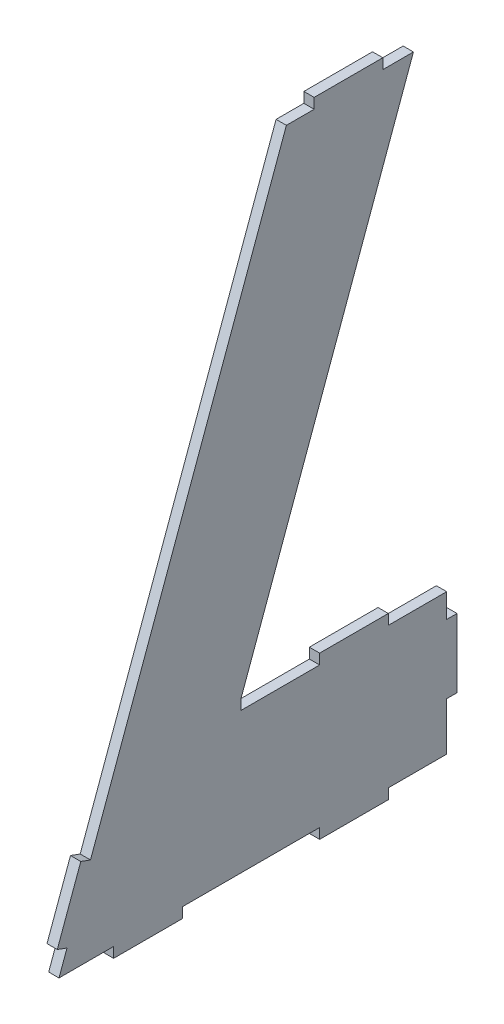
ISO-10303-21;
HEADER;
FILE_DESCRIPTION(('STEP AP214'),'2;1');
FILE_NAME('part.step','',(''),(''),'','','');
FILE_SCHEMA(('AUTOMOTIVE_DESIGN { 1 0 10303 214 1 1 1 1 }'));
ENDSEC;
DATA;
#1=APPLICATION_CONTEXT('core data for automotive mechanical design processes');
#2=APPLICATION_PROTOCOL_DEFINITION('international standard','automotive_design',2000,#1);
#3=PRODUCT_CONTEXT('',#1,'mechanical');
#4=PRODUCT('Part','Part','',(#3));
#5=PRODUCT_RELATED_PRODUCT_CATEGORY('part','',(#4));
#6=PRODUCT_DEFINITION_FORMATION('','',#4);
#7=PRODUCT_DEFINITION_CONTEXT('part definition',#1,'design');
#8=PRODUCT_DEFINITION('design','',#6,#7);
#9=PRODUCT_DEFINITION_SHAPE('','',#8);
#10=(LENGTH_UNIT() NAMED_UNIT(*) SI_UNIT(.MILLI.,.METRE.));
#11=(NAMED_UNIT(*) PLANE_ANGLE_UNIT() SI_UNIT($,.RADIAN.));
#12=(NAMED_UNIT(*) SI_UNIT($,.STERADIAN.) SOLID_ANGLE_UNIT());
#13=UNCERTAINTY_MEASURE_WITH_UNIT(LENGTH_MEASURE(1.E-05),#10,'distance_accuracy_value','');
#14=(GEOMETRIC_REPRESENTATION_CONTEXT(3) GLOBAL_UNCERTAINTY_ASSIGNED_CONTEXT((#13)) GLOBAL_UNIT_ASSIGNED_CONTEXT((#10,
#11,#12)) REPRESENTATION_CONTEXT('',''));
#15=CARTESIAN_POINT('',(0.,0.,0.));
#16=DIRECTION('',(0.,0.,1.));
#17=DIRECTION('',(1.,0.,0.));
#18=AXIS2_PLACEMENT_3D('',#15,#16,#17);
#19=CARTESIAN_POINT('',(3.001,184.938524157182,-70.3121179623345));
#20=DIRECTION('',(0.,-0.342020143325666,-0.939692620785909));
#21=DIRECTION('',(0.,0.93969262078591,-0.342020143325666));
#22=AXIS2_PLACEMENT_3D('',#19,#20,#21);
#23=PLANE('',#22);
#24=DIRECTION('',(1.,0.,0.));
#25=VECTOR('',#24,1.);
#26=CARTESIAN_POINT('',(0.,9.39692620826103,-6.42020143340297));
#27=LINE('',#26,#25);
#28=CARTESIAN_POINT('',(0.,9.39692620826099,-6.42020143340294));
#29=VERTEX_POINT('',#28);
#30=CARTESIAN_POINT('',(3.,9.39692620826096,-6.42020143340294));
#31=VERTEX_POINT('',#30);
#32=EDGE_CURVE('E48',#29,#31,#27,.T.);
#33=ORIENTED_EDGE('',*,*,#32,.F.);
#34=DIRECTION('',(0.,-0.93969262078591,0.342020143325666));
#35=VECTOR('',#34,1.);
#36=CARTESIAN_POINT('',(0.,184.938524157182,-70.3121179623345));
#37=LINE('',#36,#35);
#38=CARTESIAN_POINT('',(0.,3.,-4.0919107027986));
#39=VERTEX_POINT('',#38);
#40=EDGE_CURVE('E259',#29,#39,#37,.T.);
#41=ORIENTED_EDGE('',*,*,#40,.T.);
#42=DIRECTION('',(-1.,0.,0.));
#43=VECTOR('',#42,1.);
#44=CARTESIAN_POINT('',(3.001,3.,-4.0919107027986));
#45=LINE('',#44,#43);
#46=CARTESIAN_POINT('',(3.,3.,-4.0919107027986));
#47=VERTEX_POINT('',#46);
#48=EDGE_CURVE('E268',#47,#39,#45,.T.);
#49=ORIENTED_EDGE('',*,*,#48,.F.);
#50=DIRECTION('',(0.,0.93969262078591,-0.342020143325666));
#51=VECTOR('',#50,1.);
#52=CARTESIAN_POINT('',(3.,184.938524157182,-70.3121179623345));
#53=LINE('',#52,#51);
#54=EDGE_CURVE('E273',#47,#31,#53,.T.);
#55=ORIENTED_EDGE('',*,*,#54,.T.);
#56=EDGE_LOOP('',(#33,#41,#49,#55));
#57=FACE_BOUND('',#56,.T.);
#58=ADVANCED_FACE('F33',(#57),#23,.F.);
#59=DIRECTION('',(-1.,0.,0.));
#60=VECTOR('',#59,1.);
#61=CARTESIAN_POINT('',(0.,28.1907786239792,-13.2606042999163));
#62=LINE('',#61,#60);
#63=CARTESIAN_POINT('',(3.,28.1907786239792,-13.2606042999163));
#64=VERTEX_POINT('',#63);
#65=CARTESIAN_POINT('',(0.,28.1907786239792,-13.2606042999163));
#66=VERTEX_POINT('',#65);
#67=EDGE_CURVE('E56',#64,#66,#62,.T.);
#68=ORIENTED_EDGE('',*,*,#67,.F.);
#69=CARTESIAN_POINT('',(3.,184.938524157182,-70.3121179623345));
#70=VERTEX_POINT('',#69);
#71=EDGE_CURVE('E271',#64,#70,#53,.T.);
#72=ORIENTED_EDGE('',*,*,#71,.T.);
#73=DIRECTION('',(-1.,0.,0.));
#74=VECTOR('',#73,1.);
#75=CARTESIAN_POINT('',(3.001,184.938524157182,-70.3121179623345));
#76=LINE('',#75,#74);
#77=CARTESIAN_POINT('',(0.,184.938524157182,-70.3121179623345));
#78=VERTEX_POINT('',#77);
#79=EDGE_CURVE('E267',#70,#78,#76,.T.);
#80=ORIENTED_EDGE('',*,*,#79,.T.);
#81=EDGE_CURVE('E261',#78,#66,#37,.T.);
#82=ORIENTED_EDGE('',*,*,#81,.T.);
#83=EDGE_LOOP('',(#68,#72,#80,#82));
#84=FACE_BOUND('',#83,.T.);
#85=ADVANCED_FACE('F597',(#84),#23,.F.);
#86=CARTESIAN_POINT('',(3.,0.,0.));
#87=DIRECTION('',(0.,1.,0.));
#88=DIRECTION('',(0.,0.,1.));
#89=AXIS2_PLACEMENT_3D('',#86,#87,#88);
#90=PLANE('',#89);
#91=DIRECTION('',(0.,0.,-1.));
#92=VECTOR('',#91,1.);
#93=CARTESIAN_POINT('',(0.,0.,0.));
#94=LINE('',#93,#92);
#95=CARTESIAN_POINT('',(0.,0.,-20.));
#96=VERTEX_POINT('',#95);
#97=CARTESIAN_POINT('',(0.,0.,-40.));
#98=VERTEX_POINT('',#97);
#99=EDGE_CURVE('E464',#96,#98,#94,.T.);
#100=ORIENTED_EDGE('',*,*,#99,.T.);
#101=DIRECTION('',(1.,0.,0.));
#102=VECTOR('',#101,1.);
#103=CARTESIAN_POINT('',(0.,0.,-40.));
#104=LINE('',#103,#102);
#105=CARTESIAN_POINT('',(3.,0.,-40.));
#106=VERTEX_POINT('',#105);
#107=EDGE_CURVE('E363',#98,#106,#104,.T.);
#108=ORIENTED_EDGE('',*,*,#107,.T.);
#109=DIRECTION('',(0.,0.,-1.));
#110=VECTOR('',#109,1.);
#111=CARTESIAN_POINT('',(3.,0.,0.));
#112=LINE('',#111,#110);
#113=CARTESIAN_POINT('',(3.,0.,-20.));
#114=VERTEX_POINT('',#113);
#115=EDGE_CURVE('E459',#114,#106,#112,.T.);
#116=ORIENTED_EDGE('',*,*,#115,.F.);
#117=DIRECTION('',(1.,0.,0.));
#118=VECTOR('',#117,1.);
#119=CARTESIAN_POINT('',(0.,0.,-20.));
#120=LINE('',#119,#118);
#121=EDGE_CURVE('E385',#96,#114,#120,.T.);
#122=ORIENTED_EDGE('',*,*,#121,.F.);
#123=EDGE_LOOP('',(#100,#108,#116,#122));
#124=FACE_BOUND('',#123,.T.);
#125=ADVANCED_FACE('F577',(#124),#90,.F.);
#126=CARTESIAN_POINT('',(3.,0.,-80.));
#127=VERTEX_POINT('',#126);
#128=CARTESIAN_POINT('',(3.,0.,-100.));
#129=VERTEX_POINT('',#128);
#130=EDGE_CURVE('E462',#127,#129,#112,.T.);
#131=ORIENTED_EDGE('',*,*,#130,.F.);
#132=DIRECTION('',(1.,0.,0.));
#133=VECTOR('',#132,1.);
#134=CARTESIAN_POINT('',(0.,0.,-80.));
#135=LINE('',#134,#133);
#136=CARTESIAN_POINT('',(0.,0.,-80.));
#137=VERTEX_POINT('',#136);
#138=EDGE_CURVE('E375',#137,#127,#135,.T.);
#139=ORIENTED_EDGE('',*,*,#138,.F.);
#140=CARTESIAN_POINT('',(0.,0.,-100.));
#141=VERTEX_POINT('',#140);
#142=EDGE_CURVE('E458',#137,#141,#94,.T.);
#143=ORIENTED_EDGE('',*,*,#142,.T.);
#144=DIRECTION('',(1.,0.,0.));
#145=VECTOR('',#144,1.);
#146=CARTESIAN_POINT('',(0.,0.,-100.));
#147=LINE('',#146,#145);
#148=EDGE_CURVE('E404',#141,#129,#147,.T.);
#149=ORIENTED_EDGE('',*,*,#148,.T.);
#150=EDGE_LOOP('',(#131,#139,#143,#149));
#151=FACE_BOUND('',#150,.T.);
#152=ADVANCED_FACE('F35',(#151),#90,.F.);
#153=CARTESIAN_POINT('',(3.,187.938524157182,-68.4040286651331));
#154=DIRECTION('',(0.,-1.,0.));
#155=DIRECTION('',(0.,0.,-1.));
#156=AXIS2_PLACEMENT_3D('',#153,#154,#155);
#157=PLANE('',#156);
#158=DIRECTION('',(0.,0.,1.));
#159=VECTOR('',#158,1.);
#160=CARTESIAN_POINT('',(3.,187.938524157182,-68.4040286651331));
#161=LINE('',#160,#159);
#162=CARTESIAN_POINT('',(3.,187.938524157182,-98.4040286651331));
#163=VERTEX_POINT('',#162);
#164=CARTESIAN_POINT('',(3.,187.938524157182,-78.4040286651331));
#165=VERTEX_POINT('',#164);
#166=EDGE_CURVE('E41',#163,#165,#161,.T.);
#167=ORIENTED_EDGE('',*,*,#166,.F.);
#168=DIRECTION('',(1.,0.,0.));
#169=VECTOR('',#168,1.);
#170=CARTESIAN_POINT('',(0.,187.938524157182,-98.4040286651331));
#171=LINE('',#170,#169);
#172=CARTESIAN_POINT('',(0.,187.938524157182,-98.4040286651331));
#173=VERTEX_POINT('',#172);
#174=EDGE_CURVE('E417',#173,#163,#171,.T.);
#175=ORIENTED_EDGE('',*,*,#174,.F.);
#176=DIRECTION('',(0.,0.,1.));
#177=VECTOR('',#176,1.);
#178=CARTESIAN_POINT('',(0.,187.938524157182,-68.4040286651331));
#179=LINE('',#178,#177);
#180=CARTESIAN_POINT('',(0.,187.938524157182,-78.4040286651331));
#181=VERTEX_POINT('',#180);
#182=EDGE_CURVE('E466',#173,#181,#179,.T.);
#183=ORIENTED_EDGE('',*,*,#182,.T.);
#184=DIRECTION('',(1.,0.,0.));
#185=VECTOR('',#184,1.);
#186=CARTESIAN_POINT('',(0.,187.938524157182,-78.4040286651331));
#187=LINE('',#186,#185);
#188=EDGE_CURVE('E431',#181,#165,#187,.T.);
#189=ORIENTED_EDGE('',*,*,#188,.T.);
#190=EDGE_LOOP('',(#167,#175,#183,#189));
#191=FACE_BOUND('',#190,.T.);
#192=ADVANCED_FACE('F545',(#191),#157,.F.);
#193=CARTESIAN_POINT('',(3.,0.,0.));
#194=DIRECTION('',(-1.,0.,0.));
#195=DIRECTION('',(0.,0.,1.));
#196=AXIS2_PLACEMENT_3D('',#193,#194,#195);
#197=PLANE('',#196);
#198=DIRECTION('',(0.,0.,-1.));
#199=VECTOR('',#198,1.);
#200=CARTESIAN_POINT('',(3.,184.938524157182,-78.4040286651331));
#201=LINE('',#200,#199);
#202=CARTESIAN_POINT('',(3.,184.938524157182,-78.4040286651331));
#203=VERTEX_POINT('',#202);
#204=EDGE_CURVE('E429',#70,#203,#201,.T.);
#205=ORIENTED_EDGE('',*,*,#204,.F.);
#206=ORIENTED_EDGE('',*,*,#71,.F.);
#207=DIRECTION('',(0.,-0.342020143325666,-0.939692620785909));
#208=VECTOR('',#207,1.);
#209=CARTESIAN_POINT('',(3.,29.2168390539562,-10.4415264375586));
#210=LINE('',#209,#208);
#211=CARTESIAN_POINT('',(3.,29.2168390539562,-10.4415264375586));
#212=VERTEX_POINT('',#211);
#213=EDGE_CURVE('E263',#212,#64,#210,.T.);
#214=ORIENTED_EDGE('',*,*,#213,.F.);
#215=DIRECTION('',(0.,0.939692620785909,-0.342020143325666));
#216=VECTOR('',#215,1.);
#217=CARTESIAN_POINT('',(3.,29.2168390539562,-10.4415264375586));
#218=LINE('',#217,#216);
#219=CARTESIAN_POINT('',(3.,10.422986638238,-3.60112357104524));
#220=VERTEX_POINT('',#219);
#221=EDGE_CURVE('E245',#220,#212,#218,.T.);
#222=ORIENTED_EDGE('',*,*,#221,.F.);
#223=DIRECTION('',(0.,-0.342020143325666,-0.939692620785909));
#224=VECTOR('',#223,1.);
#225=CARTESIAN_POINT('',(3.,10.422986638238,-3.60112357104524));
#226=LINE('',#225,#224);
#227=EDGE_CURVE('E242',#220,#31,#226,.T.);
#228=ORIENTED_EDGE('',*,*,#227,.T.);
#229=ORIENTED_EDGE('',*,*,#54,.F.);
#230=DIRECTION('',(0.,0.,1.));
#231=VECTOR('',#230,1.);
#232=CARTESIAN_POINT('',(3.,3.,0.));
#233=LINE('',#232,#231);
#234=CARTESIAN_POINT('',(3.,3.,-20.));
#235=VERTEX_POINT('',#234);
#236=EDGE_CURVE('E383',#235,#47,#233,.T.);
#237=ORIENTED_EDGE('',*,*,#236,.F.);
#238=DIRECTION('',(0.,1.,0.));
#239=VECTOR('',#238,1.);
#240=CARTESIAN_POINT('',(3.,0.,-20.));
#241=LINE('',#240,#239);
#242=EDGE_CURVE('E372',#114,#235,#241,.T.);
#243=ORIENTED_EDGE('',*,*,#242,.F.);
#244=ORIENTED_EDGE('',*,*,#115,.T.);
#245=DIRECTION('',(0.,-1.,0.));
#246=VECTOR('',#245,1.);
#247=CARTESIAN_POINT('',(3.,0.,-40.));
#248=LINE('',#247,#246);
#249=CARTESIAN_POINT('',(3.,3.,-40.));
#250=VERTEX_POINT('',#249);
#251=EDGE_CURVE('E350',#250,#106,#248,.T.);
#252=ORIENTED_EDGE('',*,*,#251,.F.);
#253=DIRECTION('',(0.,0.,1.));
#254=VECTOR('',#253,1.);
#255=CARTESIAN_POINT('',(3.,3.,-40.));
#256=LINE('',#255,#254);
#257=CARTESIAN_POINT('',(3.,3.,-80.));
#258=VERTEX_POINT('',#257);
#259=EDGE_CURVE('E357',#258,#250,#256,.T.);
#260=ORIENTED_EDGE('',*,*,#259,.F.);
#261=DIRECTION('',(0.,1.,0.));
#262=VECTOR('',#261,1.);
#263=CARTESIAN_POINT('',(3.,0.,-80.));
#264=LINE('',#263,#262);
#265=EDGE_CURVE('E365',#127,#258,#264,.T.);
#266=ORIENTED_EDGE('',*,*,#265,.F.);
#267=ORIENTED_EDGE('',*,*,#130,.T.);
#268=DIRECTION('',(0.,-1.,0.));
#269=VECTOR('',#268,1.);
#270=CARTESIAN_POINT('',(3.,0.,-100.));
#271=LINE('',#270,#269);
#272=CARTESIAN_POINT('',(3.,3.,-100.));
#273=VERTEX_POINT('',#272);
#274=EDGE_CURVE('E397',#273,#129,#271,.T.);
#275=ORIENTED_EDGE('',*,*,#274,.F.);
#276=DIRECTION('',(0.,0.,1.));
#277=VECTOR('',#276,1.);
#278=CARTESIAN_POINT('',(3.,3.,-120.));
#279=LINE('',#278,#277);
#280=CARTESIAN_POINT('',(3.,3.,-117.));
#281=VERTEX_POINT('',#280);
#282=EDGE_CURVE('E392',#281,#273,#279,.T.);
#283=ORIENTED_EDGE('',*,*,#282,.F.);
#284=DIRECTION('',(0.,-1.,0.));
#285=VECTOR('',#284,1.);
#286=CARTESIAN_POINT('',(3.,3.,-117.));
#287=LINE('',#286,#285);
#288=CARTESIAN_POINT('',(3.,16.9846310392955,-117.));
#289=VERTEX_POINT('',#288);
#290=EDGE_CURVE('E280',#289,#281,#287,.T.);
#291=ORIENTED_EDGE('',*,*,#290,.F.);
#292=DIRECTION('',(0.,0.,1.));
#293=VECTOR('',#292,1.);
#294=CARTESIAN_POINT('',(3.,16.9846310392955,-120.));
#295=LINE('',#294,#293);
#296=CARTESIAN_POINT('',(3.,16.9846310392955,-120.));
#297=VERTEX_POINT('',#296);
#298=EDGE_CURVE('E275',#297,#289,#295,.T.);
#299=ORIENTED_EDGE('',*,*,#298,.F.);
#300=DIRECTION('',(0.,-1.,0.));
#301=VECTOR('',#300,1.);
#302=CARTESIAN_POINT('',(3.,0.,-120.));
#303=LINE('',#302,#301);
#304=CARTESIAN_POINT('',(3.,36.9846310392955,-120.));
#305=VERTEX_POINT('',#304);
#306=EDGE_CURVE('E438',#305,#297,#303,.T.);
#307=ORIENTED_EDGE('',*,*,#306,.F.);
#308=DIRECTION('',(0.,0.,-1.));
#309=VECTOR('',#308,1.);
#310=CARTESIAN_POINT('',(3.,36.9846310392955,-120.));
#311=LINE('',#310,#309);
#312=CARTESIAN_POINT('',(3.,36.9846310392955,-117.));
#313=VERTEX_POINT('',#312);
#314=EDGE_CURVE('E298',#313,#305,#311,.T.);
#315=ORIENTED_EDGE('',*,*,#314,.F.);
#316=DIRECTION('',(0.,-1.,0.));
#317=VECTOR('',#316,1.);
#318=CARTESIAN_POINT('',(3.,43.9846310392955,-117.));
#319=LINE('',#318,#317);
#320=CARTESIAN_POINT('',(3.,43.9846310392955,-117.));
#321=VERTEX_POINT('',#320);
#322=EDGE_CURVE('E290',#321,#313,#319,.T.);
#323=ORIENTED_EDGE('',*,*,#322,.F.);
#324=DIRECTION('',(0.,0.,-1.));
#325=VECTOR('',#324,1.);
#326=CARTESIAN_POINT('',(3.,43.9846310392955,-120.));
#327=LINE('',#326,#325);
#328=CARTESIAN_POINT('',(3.,43.9846310392955,-100.));
#329=VERTEX_POINT('',#328);
#330=EDGE_CURVE('E340',#329,#321,#327,.T.);
#331=ORIENTED_EDGE('',*,*,#330,.F.);
#332=DIRECTION('',(0.,-1.,0.));
#333=VECTOR('',#332,1.);
#334=CARTESIAN_POINT('',(3.,46.9846310392955,-100.));
#335=LINE('',#334,#333);
#336=CARTESIAN_POINT('',(3.,46.9846310392955,-100.));
#337=VERTEX_POINT('',#336);
#338=EDGE_CURVE('E332',#337,#329,#335,.T.);
#339=ORIENTED_EDGE('',*,*,#338,.F.);
#340=DIRECTION('',(0.,0.,-1.));
#341=VECTOR('',#340,1.);
#342=CARTESIAN_POINT('',(3.,46.9846310392955,-137.101007166283));
#343=LINE('',#342,#341);
#344=CARTESIAN_POINT('',(3.,46.9846310392955,-80.));
#345=VERTEX_POINT('',#344);
#346=EDGE_CURVE('E451',#345,#337,#343,.T.);
#347=ORIENTED_EDGE('',*,*,#346,.F.);
#348=DIRECTION('',(0.,1.,0.));
#349=VECTOR('',#348,1.);
#350=CARTESIAN_POINT('',(3.,46.9846310392955,-80.));
#351=LINE('',#350,#349);
#352=CARTESIAN_POINT('',(3.,43.9846310392955,-80.));
#353=VERTEX_POINT('',#352);
#354=EDGE_CURVE('E316',#353,#345,#351,.T.);
#355=ORIENTED_EDGE('',*,*,#354,.F.);
#356=DIRECTION('',(0.,0.,-1.));
#357=VECTOR('',#356,1.);
#358=CARTESIAN_POINT('',(3.,43.9846310392955,-57.1010071662833));
#359=LINE('',#358,#357);
#360=CARTESIAN_POINT('',(3.,43.9846310392955,-57.1010071662833));
#361=VERTEX_POINT('',#360);
#362=EDGE_CURVE('E325',#361,#353,#359,.T.);
#363=ORIENTED_EDGE('',*,*,#362,.F.);
#364=DIRECTION('',(0.,-1.,0.));
#365=VECTOR('',#364,1.);
#366=CARTESIAN_POINT('',(3.,46.9846310392955,-57.1010071662833));
#367=LINE('',#366,#365);
#368=CARTESIAN_POINT('',(3.,46.9846310392955,-57.1010071662833));
#369=VERTEX_POINT('',#368);
#370=EDGE_CURVE('E308',#369,#361,#367,.T.);
#371=ORIENTED_EDGE('',*,*,#370,.F.);
#372=DIRECTION('',(0.,-0.93969262078591,0.342020143325666));
#373=VECTOR('',#372,1.);
#374=CARTESIAN_POINT('',(3.,187.938524157182,-108.404028665133));
#375=LINE('',#374,#373);
#376=CARTESIAN_POINT('',(3.,184.938524157182,-107.312117962335));
#377=VERTEX_POINT('',#376);
#378=EDGE_CURVE('E444',#377,#369,#375,.T.);
#379=ORIENTED_EDGE('',*,*,#378,.F.);
#380=DIRECTION('',(0.,0.,-1.));
#381=VECTOR('',#380,1.);
#382=CARTESIAN_POINT('',(3.,184.938524157182,-108.404028665133));
#383=LINE('',#382,#381);
#384=CARTESIAN_POINT('',(3.,184.938524157182,-98.4040286651331));
#385=VERTEX_POINT('',#384);
#386=EDGE_CURVE('E414',#385,#377,#383,.T.);
#387=ORIENTED_EDGE('',*,*,#386,.F.);
#388=DIRECTION('',(0.,-1.,0.));
#389=VECTOR('',#388,1.);
#390=CARTESIAN_POINT('',(3.,187.938524157182,-98.4040286651331));
#391=LINE('',#390,#389);
#392=EDGE_CURVE('E407',#163,#385,#391,.T.);
#393=ORIENTED_EDGE('',*,*,#392,.F.);
#394=ORIENTED_EDGE('',*,*,#166,.T.);
#395=DIRECTION('',(0.,1.,0.));
#396=VECTOR('',#395,1.);
#397=CARTESIAN_POINT('',(3.,187.938524157182,-78.4040286651331));
#398=LINE('',#397,#396);
#399=EDGE_CURVE('E423',#203,#165,#398,.T.);
#400=ORIENTED_EDGE('',*,*,#399,.F.);
#401=EDGE_LOOP('',(#205,#206,#214,#222,#228,#229,#237,#243,#244,#252,#260,#266,#267,#275,#283,
#291,#299,#307,#315,#323,#331,#339,#347,#355,#363,#371,#379,#387,#393,#394,#400));
#402=FACE_BOUND('',#401,.T.);
#403=ADVANCED_FACE('F476',(#402),#197,.F.);
#404=CARTESIAN_POINT('',(0.,0.,0.));
#405=DIRECTION('',(-1.,0.,0.));
#406=DIRECTION('',(0.,0.,1.));
#407=AXIS2_PLACEMENT_3D('',#404,#405,#406);
#408=PLANE('',#407);
#409=ORIENTED_EDGE('',*,*,#81,.F.);
#410=DIRECTION('',(0.,0.,-1.));
#411=VECTOR('',#410,1.);
#412=CARTESIAN_POINT('',(0.,184.938524157182,-78.4040286651331));
#413=LINE('',#412,#411);
#414=CARTESIAN_POINT('',(0.,184.938524157182,-78.4040286651331));
#415=VERTEX_POINT('',#414);
#416=EDGE_CURVE('E428',#78,#415,#413,.T.);
#417=ORIENTED_EDGE('',*,*,#416,.T.);
#418=DIRECTION('',(0.,1.,0.));
#419=VECTOR('',#418,1.);
#420=CARTESIAN_POINT('',(0.,187.938524157182,-78.4040286651331));
#421=LINE('',#420,#419);
#422=EDGE_CURVE('E425',#415,#181,#421,.T.);
#423=ORIENTED_EDGE('',*,*,#422,.T.);
#424=ORIENTED_EDGE('',*,*,#182,.F.);
#425=DIRECTION('',(0.,-1.,0.));
#426=VECTOR('',#425,1.);
#427=CARTESIAN_POINT('',(0.,187.938524157182,-98.4040286651331));
#428=LINE('',#427,#426);
#429=CARTESIAN_POINT('',(0.,184.938524157182,-98.4040286651331));
#430=VERTEX_POINT('',#429);
#431=EDGE_CURVE('E410',#173,#430,#428,.T.);
#432=ORIENTED_EDGE('',*,*,#431,.T.);
#433=DIRECTION('',(0.,0.,-1.));
#434=VECTOR('',#433,1.);
#435=CARTESIAN_POINT('',(0.,184.938524157182,-108.404028665133));
#436=LINE('',#435,#434);
#437=CARTESIAN_POINT('',(0.,184.938524157182,-107.312117962335));
#438=VERTEX_POINT('',#437);
#439=EDGE_CURVE('E413',#430,#438,#436,.T.);
#440=ORIENTED_EDGE('',*,*,#439,.T.);
#441=DIRECTION('',(0.,-0.93969262078591,0.342020143325666));
#442=VECTOR('',#441,1.);
#443=CARTESIAN_POINT('',(0.,187.938524157182,-108.404028665133));
#444=LINE('',#443,#442);
#445=CARTESIAN_POINT('',(0.,46.9846310392955,-57.1010071662833));
#446=VERTEX_POINT('',#445);
#447=EDGE_CURVE('E447',#438,#446,#444,.T.);
#448=ORIENTED_EDGE('',*,*,#447,.T.);
#449=DIRECTION('',(0.,-1.,0.));
#450=VECTOR('',#449,1.);
#451=CARTESIAN_POINT('',(0.,46.9846310392955,-57.1010071662833));
#452=LINE('',#451,#450);
#453=CARTESIAN_POINT('',(0.,43.9846310392955,-57.1010071662833));
#454=VERTEX_POINT('',#453);
#455=EDGE_CURVE('E312',#446,#454,#452,.T.);
#456=ORIENTED_EDGE('',*,*,#455,.T.);
#457=DIRECTION('',(0.,0.,-1.));
#458=VECTOR('',#457,1.);
#459=CARTESIAN_POINT('',(0.,43.9846310392955,-57.1010071662833));
#460=LINE('',#459,#458);
#461=CARTESIAN_POINT('',(0.,43.9846310392955,-80.));
#462=VERTEX_POINT('',#461);
#463=EDGE_CURVE('E315',#454,#462,#460,.T.);
#464=ORIENTED_EDGE('',*,*,#463,.T.);
#465=DIRECTION('',(0.,1.,0.));
#466=VECTOR('',#465,1.);
#467=CARTESIAN_POINT('',(0.,46.9846310392955,-80.));
#468=LINE('',#467,#466);
#469=CARTESIAN_POINT('',(0.,46.9846310392955,-80.));
#470=VERTEX_POINT('',#469);
#471=EDGE_CURVE('E319',#462,#470,#468,.T.);
#472=ORIENTED_EDGE('',*,*,#471,.T.);
#473=DIRECTION('',(0.,0.,-1.));
#474=VECTOR('',#473,1.);
#475=CARTESIAN_POINT('',(0.,46.9846310392955,-137.101007166283));
#476=LINE('',#475,#474);
#477=CARTESIAN_POINT('',(0.,46.9846310392955,-100.));
#478=VERTEX_POINT('',#477);
#479=EDGE_CURVE('E450',#470,#478,#476,.T.);
#480=ORIENTED_EDGE('',*,*,#479,.T.);
#481=DIRECTION('',(0.,-1.,0.));
#482=VECTOR('',#481,1.);
#483=CARTESIAN_POINT('',(0.,46.9846310392955,-100.));
#484=LINE('',#483,#482);
#485=CARTESIAN_POINT('',(0.,43.9846310392955,-100.));
#486=VERTEX_POINT('',#485);
#487=EDGE_CURVE('E336',#478,#486,#484,.T.);
#488=ORIENTED_EDGE('',*,*,#487,.T.);
#489=DIRECTION('',(0.,0.,-1.));
#490=VECTOR('',#489,1.);
#491=CARTESIAN_POINT('',(0.,43.9846310392955,-120.));
#492=LINE('',#491,#490);
#493=CARTESIAN_POINT('',(0.,43.9846310392955,-117.));
#494=VERTEX_POINT('',#493);
#495=EDGE_CURVE('E339',#486,#494,#492,.T.);
#496=ORIENTED_EDGE('',*,*,#495,.T.);
#497=DIRECTION('',(0.,-1.,0.));
#498=VECTOR('',#497,1.);
#499=CARTESIAN_POINT('',(0.,43.9846310392955,-117.));
#500=LINE('',#499,#498);
#501=CARTESIAN_POINT('',(0.,36.9846310392955,-117.));
#502=VERTEX_POINT('',#501);
#503=EDGE_CURVE('E294',#494,#502,#500,.T.);
#504=ORIENTED_EDGE('',*,*,#503,.T.);
#505=DIRECTION('',(0.,0.,-1.));
#506=VECTOR('',#505,1.);
#507=CARTESIAN_POINT('',(0.,36.9846310392955,-120.));
#508=LINE('',#507,#506);
#509=CARTESIAN_POINT('',(0.,36.9846310392955,-120.));
#510=VERTEX_POINT('',#509);
#511=EDGE_CURVE('E297',#502,#510,#508,.T.);
#512=ORIENTED_EDGE('',*,*,#511,.T.);
#513=DIRECTION('',(0.,-1.,0.));
#514=VECTOR('',#513,1.);
#515=CARTESIAN_POINT('',(0.,0.,-120.));
#516=LINE('',#515,#514);
#517=CARTESIAN_POINT('',(0.,16.9846310392955,-120.));
#518=VERTEX_POINT('',#517);
#519=EDGE_CURVE('E441',#510,#518,#516,.T.);
#520=ORIENTED_EDGE('',*,*,#519,.T.);
#521=DIRECTION('',(0.,0.,1.));
#522=VECTOR('',#521,1.);
#523=CARTESIAN_POINT('',(0.,16.9846310392955,-120.));
#524=LINE('',#523,#522);
#525=CARTESIAN_POINT('',(0.,16.9846310392955,-117.));
#526=VERTEX_POINT('',#525);
#527=EDGE_CURVE('E276',#518,#526,#524,.T.);
#528=ORIENTED_EDGE('',*,*,#527,.T.);
#529=DIRECTION('',(0.,-1.,0.));
#530=VECTOR('',#529,1.);
#531=CARTESIAN_POINT('',(0.,3.,-117.));
#532=LINE('',#531,#530);
#533=CARTESIAN_POINT('',(0.,3.,-117.));
#534=VERTEX_POINT('',#533);
#535=EDGE_CURVE('E279',#526,#534,#532,.T.);
#536=ORIENTED_EDGE('',*,*,#535,.T.);
#537=DIRECTION('',(0.,0.,1.));
#538=VECTOR('',#537,1.);
#539=CARTESIAN_POINT('',(0.,3.,-120.));
#540=LINE('',#539,#538);
#541=CARTESIAN_POINT('',(0.,3.,-100.));
#542=VERTEX_POINT('',#541);
#543=EDGE_CURVE('E394',#534,#542,#540,.T.);
#544=ORIENTED_EDGE('',*,*,#543,.T.);
#545=DIRECTION('',(0.,-1.,0.));
#546=VECTOR('',#545,1.);
#547=CARTESIAN_POINT('',(0.,0.,-100.));
#548=LINE('',#547,#546);
#549=EDGE_CURVE('E396',#542,#141,#548,.T.);
#550=ORIENTED_EDGE('',*,*,#549,.T.);
#551=ORIENTED_EDGE('',*,*,#142,.F.);
#552=DIRECTION('',(0.,1.,0.));
#553=VECTOR('',#552,1.);
#554=CARTESIAN_POINT('',(0.,0.,-80.));
#555=LINE('',#554,#553);
#556=CARTESIAN_POINT('',(0.,3.,-80.));
#557=VERTEX_POINT('',#556);
#558=EDGE_CURVE('E356',#137,#557,#555,.T.);
#559=ORIENTED_EDGE('',*,*,#558,.T.);
#560=DIRECTION('',(0.,0.,1.));
#561=VECTOR('',#560,1.);
#562=CARTESIAN_POINT('',(0.,3.,-40.));
#563=LINE('',#562,#561);
#564=CARTESIAN_POINT('',(0.,3.,-40.));
#565=VERTEX_POINT('',#564);
#566=EDGE_CURVE('E360',#557,#565,#563,.T.);
#567=ORIENTED_EDGE('',*,*,#566,.T.);
#568=DIRECTION('',(0.,-1.,0.));
#569=VECTOR('',#568,1.);
#570=CARTESIAN_POINT('',(0.,0.,-40.));
#571=LINE('',#570,#569);
#572=EDGE_CURVE('E353',#565,#98,#571,.T.);
#573=ORIENTED_EDGE('',*,*,#572,.T.);
#574=ORIENTED_EDGE('',*,*,#99,.F.);
#575=DIRECTION('',(0.,1.,0.));
#576=VECTOR('',#575,1.);
#577=CARTESIAN_POINT('',(0.,0.,-20.));
#578=LINE('',#577,#576);
#579=CARTESIAN_POINT('',(0.,3.,-20.));
#580=VERTEX_POINT('',#579);
#581=EDGE_CURVE('E379',#96,#580,#578,.T.);
#582=ORIENTED_EDGE('',*,*,#581,.T.);
#583=DIRECTION('',(0.,0.,1.));
#584=VECTOR('',#583,1.);
#585=CARTESIAN_POINT('',(0.,3.,0.));
#586=LINE('',#585,#584);
#587=EDGE_CURVE('E382',#580,#39,#586,.T.);
#588=ORIENTED_EDGE('',*,*,#587,.T.);
#589=ORIENTED_EDGE('',*,*,#40,.F.);
#590=DIRECTION('',(0.,-0.342020143325666,-0.939692620785909));
#591=VECTOR('',#590,1.);
#592=CARTESIAN_POINT('',(0.,10.422986638238,-3.60112357104524));
#593=LINE('',#592,#591);
#594=CARTESIAN_POINT('',(0.,10.422986638238,-3.60112357104524));
#595=VERTEX_POINT('',#594);
#596=EDGE_CURVE('E240',#595,#29,#593,.T.);
#597=ORIENTED_EDGE('',*,*,#596,.F.);
#598=DIRECTION('',(0.,-0.939692620785909,0.342020143325666));
#599=VECTOR('',#598,1.);
#600=CARTESIAN_POINT('',(0.,29.2168390539562,-10.4415264375586));
#601=LINE('',#600,#599);
#602=CARTESIAN_POINT('',(0.,29.2168390539562,-10.4415264375586));
#603=VERTEX_POINT('',#602);
#604=EDGE_CURVE('E246',#603,#595,#601,.T.);
#605=ORIENTED_EDGE('',*,*,#604,.F.);
#606=DIRECTION('',(0.,-0.342020143325666,-0.939692620785909));
#607=VECTOR('',#606,1.);
#608=CARTESIAN_POINT('',(0.,29.2168390539562,-10.4415264375586));
#609=LINE('',#608,#607);
#610=EDGE_CURVE('E559',#603,#66,#609,.T.);
#611=ORIENTED_EDGE('',*,*,#610,.T.);
#612=EDGE_LOOP('',(#409,#417,#423,#424,#432,#440,#448,#456,#464,#472,#480,#488,#496,#504,#512,
#520,#528,#536,#544,#550,#551,#559,#567,#573,#574,#582,#588,#589,#597,#605,#611));
#613=FACE_BOUND('',#612,.T.);
#614=ADVANCED_FACE('F257',(#613),#408,.T.);
#615=CARTESIAN_POINT('',(0.,46.9846310392955,-137.101007166283));
#616=DIRECTION('',(0.,-1.,0.));
#617=DIRECTION('',(0.,0.,-1.));
#618=AXIS2_PLACEMENT_3D('',#615,#616,#617);
#619=PLANE('',#618);
#620=ORIENTED_EDGE('',*,*,#479,.F.);
#621=DIRECTION('',(1.,0.,0.));
#622=VECTOR('',#621,1.);
#623=CARTESIAN_POINT('',(0.,46.9846310392955,-80.));
#624=LINE('',#623,#622);
#625=EDGE_CURVE('E329',#470,#345,#624,.T.);
#626=ORIENTED_EDGE('',*,*,#625,.T.);
#627=ORIENTED_EDGE('',*,*,#346,.T.);
#628=DIRECTION('',(1.,0.,0.));
#629=VECTOR('',#628,1.);
#630=CARTESIAN_POINT('',(0.,46.9846310392955,-100.));
#631=LINE('',#630,#629);
#632=EDGE_CURVE('E343',#478,#337,#631,.T.);
#633=ORIENTED_EDGE('',*,*,#632,.F.);
#634=EDGE_LOOP('',(#620,#626,#627,#633));
#635=FACE_BOUND('',#634,.T.);
#636=ADVANCED_FACE('F523',(#635),#619,.F.);
#637=CARTESIAN_POINT('',(0.,187.938524157182,-108.404028665133));
#638=DIRECTION('',(0.,0.342020143325665,0.93969262078591));
#639=DIRECTION('',(0.,-0.93969262078591,0.342020143325665));
#640=AXIS2_PLACEMENT_3D('',#637,#638,#639);
#641=PLANE('',#640);
#642=ORIENTED_EDGE('',*,*,#447,.F.);
#643=DIRECTION('',(1.,0.,0.));
#644=VECTOR('',#643,1.);
#645=CARTESIAN_POINT('',(0.,184.938524157182,-107.312117962335));
#646=LINE('',#645,#644);
#647=EDGE_CURVE('E11',#438,#377,#646,.T.);
#648=ORIENTED_EDGE('',*,*,#647,.T.);
#649=ORIENTED_EDGE('',*,*,#378,.T.);
#650=DIRECTION('',(1.,0.,0.));
#651=VECTOR('',#650,1.);
#652=CARTESIAN_POINT('',(0.,46.9846310392955,-57.1010071662833));
#653=LINE('',#652,#651);
#654=EDGE_CURVE('E453',#446,#369,#653,.T.);
#655=ORIENTED_EDGE('',*,*,#654,.F.);
#656=EDGE_LOOP('',(#642,#648,#649,#655));
#657=FACE_BOUND('',#656,.T.);
#658=ADVANCED_FACE('F537',(#657),#641,.F.);
#659=CARTESIAN_POINT('',(0.,0.,-120.));
#660=DIRECTION('',(0.,0.,1.));
#661=DIRECTION('',(1.,0.,0.));
#662=AXIS2_PLACEMENT_3D('',#659,#660,#661);
#663=PLANE('',#662);
#664=ORIENTED_EDGE('',*,*,#306,.T.);
#665=DIRECTION('',(1.,0.,0.));
#666=VECTOR('',#665,1.);
#667=CARTESIAN_POINT('',(0.,16.9846310392955,-120.));
#668=LINE('',#667,#666);
#669=EDGE_CURVE('E283',#518,#297,#668,.T.);
#670=ORIENTED_EDGE('',*,*,#669,.F.);
#671=ORIENTED_EDGE('',*,*,#519,.F.);
#672=DIRECTION('',(1.,0.,0.));
#673=VECTOR('',#672,1.);
#674=CARTESIAN_POINT('',(0.,36.9846310392955,-120.));
#675=LINE('',#674,#673);
#676=EDGE_CURVE('E305',#510,#305,#675,.T.);
#677=ORIENTED_EDGE('',*,*,#676,.T.);
#678=EDGE_LOOP('',(#664,#670,#671,#677));
#679=FACE_BOUND('',#678,.T.);
#680=ADVANCED_FACE('F501',(#679),#663,.F.);
#681=CARTESIAN_POINT('',(0.,187.938524157182,-78.4040286651331));
#682=DIRECTION('',(0.,0.,-1.));
#683=DIRECTION('',(-1.,0.,0.));
#684=AXIS2_PLACEMENT_3D('',#681,#682,#683);
#685=PLANE('',#684);
#686=ORIENTED_EDGE('',*,*,#399,.T.);
#687=ORIENTED_EDGE('',*,*,#188,.F.);
#688=ORIENTED_EDGE('',*,*,#422,.F.);
#689=DIRECTION('',(1.,0.,0.));
#690=VECTOR('',#689,1.);
#691=CARTESIAN_POINT('',(0.,184.938524157182,-78.4040286651331));
#692=LINE('',#691,#690);
#693=EDGE_CURVE('E435',#415,#203,#692,.T.);
#694=ORIENTED_EDGE('',*,*,#693,.T.);
#695=EDGE_LOOP('',(#686,#687,#688,#694));
#696=FACE_BOUND('',#695,.T.);
#697=ADVANCED_FACE('F548',(#696),#685,.F.);
#698=CARTESIAN_POINT('',(0.,184.938524157182,-78.4040286651331));
#699=DIRECTION('',(0.,-1.,0.));
#700=DIRECTION('',(0.,0.,-1.));
#701=AXIS2_PLACEMENT_3D('',#698,#699,#700);
#702=PLANE('',#701);
#703=ORIENTED_EDGE('',*,*,#416,.F.);
#704=ORIENTED_EDGE('',*,*,#79,.F.);
#705=ORIENTED_EDGE('',*,*,#204,.T.);
#706=ORIENTED_EDGE('',*,*,#693,.F.);
#707=EDGE_LOOP('',(#703,#704,#705,#706));
#708=FACE_BOUND('',#707,.T.);
#709=ADVANCED_FACE('F553',(#708),#702,.F.);
#710=CARTESIAN_POINT('',(0.,184.938524157182,-108.404028665133));
#711=DIRECTION('',(0.,-1.,0.));
#712=DIRECTION('',(0.,0.,-1.));
#713=AXIS2_PLACEMENT_3D('',#710,#711,#712);
#714=PLANE('',#713);
#715=ORIENTED_EDGE('',*,*,#439,.F.);
#716=DIRECTION('',(1.,0.,0.));
#717=VECTOR('',#716,1.);
#718=CARTESIAN_POINT('',(0.,184.938524157182,-98.4040286651331));
#719=LINE('',#718,#717);
#720=EDGE_CURVE('E421',#430,#385,#719,.T.);
#721=ORIENTED_EDGE('',*,*,#720,.T.);
#722=ORIENTED_EDGE('',*,*,#386,.T.);
#723=ORIENTED_EDGE('',*,*,#647,.F.);
#724=EDGE_LOOP('',(#715,#721,#722,#723));
#725=FACE_BOUND('',#724,.T.);
#726=ADVANCED_FACE('F540',(#725),#714,.F.);
#727=CARTESIAN_POINT('',(0.,187.938524157182,-98.4040286651331));
#728=DIRECTION('',(0.,0.,1.));
#729=DIRECTION('',(1.,0.,0.));
#730=AXIS2_PLACEMENT_3D('',#727,#728,#729);
#731=PLANE('',#730);
#732=ORIENTED_EDGE('',*,*,#392,.T.);
#733=ORIENTED_EDGE('',*,*,#720,.F.);
#734=ORIENTED_EDGE('',*,*,#431,.F.);
#735=ORIENTED_EDGE('',*,*,#174,.T.);
#736=EDGE_LOOP('',(#732,#733,#734,#735));
#737=FACE_BOUND('',#736,.T.);
#738=ADVANCED_FACE('F542',(#737),#731,.F.);
#739=CARTESIAN_POINT('',(0.,0.,-100.));
#740=DIRECTION('',(0.,0.,1.));
#741=DIRECTION('',(1.,0.,0.));
#742=AXIS2_PLACEMENT_3D('',#739,#740,#741);
#743=PLANE('',#742);
#744=ORIENTED_EDGE('',*,*,#274,.T.);
#745=ORIENTED_EDGE('',*,*,#148,.F.);
#746=ORIENTED_EDGE('',*,*,#549,.F.);
#747=DIRECTION('',(1.,0.,0.));
#748=VECTOR('',#747,1.);
#749=CARTESIAN_POINT('',(0.,3.,-100.));
#750=LINE('',#749,#748);
#751=EDGE_CURVE('E400',#542,#273,#750,.T.);
#752=ORIENTED_EDGE('',*,*,#751,.T.);
#753=EDGE_LOOP('',(#744,#745,#746,#752));
#754=FACE_BOUND('',#753,.T.);
#755=ADVANCED_FACE('F483',(#754),#743,.F.);
#756=CARTESIAN_POINT('',(0.,3.,-120.));
#757=DIRECTION('',(0.,1.,0.));
#758=DIRECTION('',(0.,0.,1.));
#759=AXIS2_PLACEMENT_3D('',#756,#757,#758);
#760=PLANE('',#759);
#761=ORIENTED_EDGE('',*,*,#543,.F.);
#762=DIRECTION('',(1.,0.,0.));
#763=VECTOR('',#762,1.);
#764=CARTESIAN_POINT('',(0.,3.,-117.));
#765=LINE('',#764,#763);
#766=EDGE_CURVE('E287',#534,#281,#765,.T.);
#767=ORIENTED_EDGE('',*,*,#766,.T.);
#768=ORIENTED_EDGE('',*,*,#282,.T.);
#769=ORIENTED_EDGE('',*,*,#751,.F.);
#770=EDGE_LOOP('',(#761,#767,#768,#769));
#771=FACE_BOUND('',#770,.T.);
#772=ADVANCED_FACE('F490',(#771),#760,.F.);
#773=CARTESIAN_POINT('',(0.,3.,0.));
#774=DIRECTION('',(0.,1.,0.));
#775=DIRECTION('',(0.,0.,1.));
#776=AXIS2_PLACEMENT_3D('',#773,#774,#775);
#777=PLANE('',#776);
#778=ORIENTED_EDGE('',*,*,#236,.T.);
#779=ORIENTED_EDGE('',*,*,#48,.T.);
#780=ORIENTED_EDGE('',*,*,#587,.F.);
#781=DIRECTION('',(1.,0.,0.));
#782=VECTOR('',#781,1.);
#783=CARTESIAN_POINT('',(0.,3.,-20.));
#784=LINE('',#783,#782);
#785=EDGE_CURVE('E390',#580,#235,#784,.T.);
#786=ORIENTED_EDGE('',*,*,#785,.T.);
#787=EDGE_LOOP('',(#778,#779,#780,#786));
#788=FACE_BOUND('',#787,.T.);
#789=ADVANCED_FACE('F569',(#788),#777,.F.);
#790=CARTESIAN_POINT('',(0.,0.,-20.));
#791=DIRECTION('',(0.,0.,-1.));
#792=DIRECTION('',(-1.,0.,0.));
#793=AXIS2_PLACEMENT_3D('',#790,#791,#792);
#794=PLANE('',#793);
#795=ORIENTED_EDGE('',*,*,#242,.T.);
#796=ORIENTED_EDGE('',*,*,#785,.F.);
#797=ORIENTED_EDGE('',*,*,#581,.F.);
#798=ORIENTED_EDGE('',*,*,#121,.T.);
#799=EDGE_LOOP('',(#795,#796,#797,#798));
#800=FACE_BOUND('',#799,.T.);
#801=ADVANCED_FACE('F572',(#800),#794,.F.);
#802=CARTESIAN_POINT('',(0.,0.,-40.));
#803=DIRECTION('',(0.,0.,1.));
#804=DIRECTION('',(1.,0.,0.));
#805=AXIS2_PLACEMENT_3D('',#802,#803,#804);
#806=PLANE('',#805);
#807=ORIENTED_EDGE('',*,*,#251,.T.);
#808=ORIENTED_EDGE('',*,*,#107,.F.);
#809=ORIENTED_EDGE('',*,*,#572,.F.);
#810=DIRECTION('',(1.,0.,0.));
#811=VECTOR('',#810,1.);
#812=CARTESIAN_POINT('',(0.,3.,-40.));
#813=LINE('',#812,#811);
#814=EDGE_CURVE('E370',#565,#250,#813,.T.);
#815=ORIENTED_EDGE('',*,*,#814,.T.);
#816=EDGE_LOOP('',(#807,#808,#809,#815));
#817=FACE_BOUND('',#816,.T.);
#818=ADVANCED_FACE('F581',(#817),#806,.F.);
#819=CARTESIAN_POINT('',(0.,3.,-40.));
#820=DIRECTION('',(0.,1.,0.));
#821=DIRECTION('',(0.,0.,1.));
#822=AXIS2_PLACEMENT_3D('',#819,#820,#821);
#823=PLANE('',#822);
#824=ORIENTED_EDGE('',*,*,#259,.T.);
#825=ORIENTED_EDGE('',*,*,#814,.F.);
#826=ORIENTED_EDGE('',*,*,#566,.F.);
#827=DIRECTION('',(1.,0.,0.));
#828=VECTOR('',#827,1.);
#829=CARTESIAN_POINT('',(0.,3.,-80.));
#830=LINE('',#829,#828);
#831=EDGE_CURVE('E373',#557,#258,#830,.T.);
#832=ORIENTED_EDGE('',*,*,#831,.T.);
#833=EDGE_LOOP('',(#824,#825,#826,#832));
#834=FACE_BOUND('',#833,.T.);
#835=ADVANCED_FACE('F584',(#834),#823,.F.);
#836=CARTESIAN_POINT('',(0.,0.,-80.));
#837=DIRECTION('',(0.,0.,-1.));
#838=DIRECTION('',(-1.,0.,0.));
#839=AXIS2_PLACEMENT_3D('',#836,#837,#838);
#840=PLANE('',#839);
#841=ORIENTED_EDGE('',*,*,#265,.T.);
#842=ORIENTED_EDGE('',*,*,#831,.F.);
#843=ORIENTED_EDGE('',*,*,#558,.F.);
#844=ORIENTED_EDGE('',*,*,#138,.T.);
#845=EDGE_LOOP('',(#841,#842,#843,#844));
#846=FACE_BOUND('',#845,.T.);
#847=ADVANCED_FACE('F586',(#846),#840,.F.);
#848=CARTESIAN_POINT('',(0.,43.9846310392955,-120.));
#849=DIRECTION('',(0.,-1.,0.));
#850=DIRECTION('',(0.,0.,-1.));
#851=AXIS2_PLACEMENT_3D('',#848,#849,#850);
#852=PLANE('',#851);
#853=ORIENTED_EDGE('',*,*,#330,.T.);
#854=DIRECTION('',(1.,0.,0.));
#855=VECTOR('',#854,1.);
#856=CARTESIAN_POINT('',(0.,43.9846310392955,-117.));
#857=LINE('',#856,#855);
#858=EDGE_CURVE('E301',#494,#321,#857,.T.);
#859=ORIENTED_EDGE('',*,*,#858,.F.);
#860=ORIENTED_EDGE('',*,*,#495,.F.);
#861=DIRECTION('',(1.,0.,0.));
#862=VECTOR('',#861,1.);
#863=CARTESIAN_POINT('',(0.,43.9846310392955,-100.));
#864=LINE('',#863,#862);
#865=EDGE_CURVE('E348',#486,#329,#864,.T.);
#866=ORIENTED_EDGE('',*,*,#865,.T.);
#867=EDGE_LOOP('',(#853,#859,#860,#866));
#868=FACE_BOUND('',#867,.T.);
#869=ADVANCED_FACE('F512',(#868),#852,.F.);
#870=CARTESIAN_POINT('',(0.,46.9846310392955,-100.));
#871=DIRECTION('',(0.,0.,1.));
#872=DIRECTION('',(1.,0.,0.));
#873=AXIS2_PLACEMENT_3D('',#870,#871,#872);
#874=PLANE('',#873);
#875=ORIENTED_EDGE('',*,*,#338,.T.);
#876=ORIENTED_EDGE('',*,*,#865,.F.);
#877=ORIENTED_EDGE('',*,*,#487,.F.);
#878=ORIENTED_EDGE('',*,*,#632,.T.);
#879=EDGE_LOOP('',(#875,#876,#877,#878));
#880=FACE_BOUND('',#879,.T.);
#881=ADVANCED_FACE('F516',(#880),#874,.F.);
#882=CARTESIAN_POINT('',(0.,46.9846310392955,-57.1010071662833));
#883=DIRECTION('',(0.,0.,1.));
#884=DIRECTION('',(1.,0.,0.));
#885=AXIS2_PLACEMENT_3D('',#882,#883,#884);
#886=PLANE('',#885);
#887=ORIENTED_EDGE('',*,*,#370,.T.);
#888=DIRECTION('',(1.,0.,0.));
#889=VECTOR('',#888,1.);
#890=CARTESIAN_POINT('',(0.,43.9846310392955,-57.1010071662833));
#891=LINE('',#890,#889);
#892=EDGE_CURVE('E322',#454,#361,#891,.T.);
#893=ORIENTED_EDGE('',*,*,#892,.F.);
#894=ORIENTED_EDGE('',*,*,#455,.F.);
#895=ORIENTED_EDGE('',*,*,#654,.T.);
#896=EDGE_LOOP('',(#887,#893,#894,#895));
#897=FACE_BOUND('',#896,.T.);
#898=ADVANCED_FACE('F616',(#897),#886,.F.);
#899=CARTESIAN_POINT('',(0.,46.9846310392955,-80.));
#900=DIRECTION('',(0.,0.,-1.));
#901=DIRECTION('',(-1.,0.,0.));
#902=AXIS2_PLACEMENT_3D('',#899,#900,#901);
#903=PLANE('',#902);
#904=ORIENTED_EDGE('',*,*,#354,.T.);
#905=ORIENTED_EDGE('',*,*,#625,.F.);
#906=ORIENTED_EDGE('',*,*,#471,.F.);
#907=DIRECTION('',(1.,0.,0.));
#908=VECTOR('',#907,1.);
#909=CARTESIAN_POINT('',(0.,43.9846310392955,-80.));
#910=LINE('',#909,#908);
#911=EDGE_CURVE('E333',#462,#353,#910,.T.);
#912=ORIENTED_EDGE('',*,*,#911,.T.);
#913=EDGE_LOOP('',(#904,#905,#906,#912));
#914=FACE_BOUND('',#913,.T.);
#915=ADVANCED_FACE('F526',(#914),#903,.F.);
#916=CARTESIAN_POINT('',(0.,43.9846310392955,-57.1010071662833));
#917=DIRECTION('',(0.,-1.,0.));
#918=DIRECTION('',(0.,0.,-1.));
#919=AXIS2_PLACEMENT_3D('',#916,#917,#918);
#920=PLANE('',#919);
#921=ORIENTED_EDGE('',*,*,#362,.T.);
#922=ORIENTED_EDGE('',*,*,#911,.F.);
#923=ORIENTED_EDGE('',*,*,#463,.F.);
#924=ORIENTED_EDGE('',*,*,#892,.T.);
#925=EDGE_LOOP('',(#921,#922,#923,#924));
#926=FACE_BOUND('',#925,.T.);
#927=ADVANCED_FACE('F529',(#926),#920,.F.);
#928=CARTESIAN_POINT('',(0.,36.9846310392955,-120.));
#929=DIRECTION('',(0.,-1.,0.));
#930=DIRECTION('',(0.,0.,-1.));
#931=AXIS2_PLACEMENT_3D('',#928,#929,#930);
#932=PLANE('',#931);
#933=ORIENTED_EDGE('',*,*,#314,.T.);
#934=ORIENTED_EDGE('',*,*,#676,.F.);
#935=ORIENTED_EDGE('',*,*,#511,.F.);
#936=DIRECTION('',(1.,0.,0.));
#937=VECTOR('',#936,1.);
#938=CARTESIAN_POINT('',(0.,36.9846310392955,-117.));
#939=LINE('',#938,#937);
#940=EDGE_CURVE('E309',#502,#313,#939,.T.);
#941=ORIENTED_EDGE('',*,*,#940,.T.);
#942=EDGE_LOOP('',(#933,#934,#935,#941));
#943=FACE_BOUND('',#942,.T.);
#944=ADVANCED_FACE('F504',(#943),#932,.F.);
#945=CARTESIAN_POINT('',(0.,43.9846310392955,-117.));
#946=DIRECTION('',(0.,0.,1.));
#947=DIRECTION('',(1.,0.,0.));
#948=AXIS2_PLACEMENT_3D('',#945,#946,#947);
#949=PLANE('',#948);
#950=ORIENTED_EDGE('',*,*,#322,.T.);
#951=ORIENTED_EDGE('',*,*,#940,.F.);
#952=ORIENTED_EDGE('',*,*,#503,.F.);
#953=ORIENTED_EDGE('',*,*,#858,.T.);
#954=EDGE_LOOP('',(#950,#951,#952,#953));
#955=FACE_BOUND('',#954,.T.);
#956=ADVANCED_FACE('F608',(#955),#949,.F.);
#957=CARTESIAN_POINT('',(0.,3.,-117.));
#958=DIRECTION('',(0.,0.,1.));
#959=DIRECTION('',(1.,0.,0.));
#960=AXIS2_PLACEMENT_3D('',#957,#958,#959);
#961=PLANE('',#960);
#962=ORIENTED_EDGE('',*,*,#290,.T.);
#963=ORIENTED_EDGE('',*,*,#766,.F.);
#964=ORIENTED_EDGE('',*,*,#535,.F.);
#965=DIRECTION('',(1.,0.,0.));
#966=VECTOR('',#965,1.);
#967=CARTESIAN_POINT('',(0.,16.9846310392955,-117.));
#968=LINE('',#967,#966);
#969=EDGE_CURVE('E291',#526,#289,#968,.T.);
#970=ORIENTED_EDGE('',*,*,#969,.T.);
#971=EDGE_LOOP('',(#962,#963,#964,#970));
#972=FACE_BOUND('',#971,.T.);
#973=ADVANCED_FACE('F495',(#972),#961,.F.);
#974=CARTESIAN_POINT('',(0.,16.9846310392955,-120.));
#975=DIRECTION('',(0.,1.,0.));
#976=DIRECTION('',(0.,0.,1.));
#977=AXIS2_PLACEMENT_3D('',#974,#975,#976);
#978=PLANE('',#977);
#979=ORIENTED_EDGE('',*,*,#298,.T.);
#980=ORIENTED_EDGE('',*,*,#969,.F.);
#981=ORIENTED_EDGE('',*,*,#527,.F.);
#982=ORIENTED_EDGE('',*,*,#669,.T.);
#983=EDGE_LOOP('',(#979,#980,#981,#982));
#984=FACE_BOUND('',#983,.T.);
#985=ADVANCED_FACE('F497',(#984),#978,.F.);
#986=CARTESIAN_POINT('',(0.,10.422986638238,-3.60112357104524));
#987=DIRECTION('',(0.,0.93969262078591,-0.342020143325666));
#988=DIRECTION('',(0.,0.342020143325666,0.93969262078591));
#989=AXIS2_PLACEMENT_3D('',#986,#987,#988);
#990=PLANE('',#989);
#991=ORIENTED_EDGE('',*,*,#32,.T.);
#992=ORIENTED_EDGE('',*,*,#227,.F.);
#993=DIRECTION('',(1.,0.,0.));
#994=VECTOR('',#993,1.);
#995=CARTESIAN_POINT('',(0.,10.422986638238,-3.60112357104524));
#996=LINE('',#995,#994);
#997=EDGE_CURVE('E236',#595,#220,#996,.T.);
#998=ORIENTED_EDGE('',*,*,#997,.F.);
#999=ORIENTED_EDGE('',*,*,#596,.T.);
#1000=EDGE_LOOP('',(#991,#992,#998,#999));
#1001=FACE_BOUND('',#1000,.T.);
#1002=ADVANCED_FACE('F238',(#1001),#990,.F.);
#1003=CARTESIAN_POINT('',(0.,29.2168390539562,-10.4415264375586));
#1004=DIRECTION('',(0.,-0.939692620785909,0.342020143325666));
#1005=DIRECTION('',(0.,-0.342020143325666,-0.93969262078591));
#1006=AXIS2_PLACEMENT_3D('',#1003,#1004,#1005);
#1007=PLANE('',#1006);
#1008=ORIENTED_EDGE('',*,*,#67,.T.);
#1009=ORIENTED_EDGE('',*,*,#610,.F.);
#1010=DIRECTION('',(-1.,0.,0.));
#1011=VECTOR('',#1010,1.);
#1012=CARTESIAN_POINT('',(0.,29.2168390539562,-10.4415264375586));
#1013=LINE('',#1012,#1011);
#1014=EDGE_CURVE('E251',#212,#603,#1013,.T.);
#1015=ORIENTED_EDGE('',*,*,#1014,.F.);
#1016=ORIENTED_EDGE('',*,*,#213,.T.);
#1017=EDGE_LOOP('',(#1008,#1009,#1015,#1016));
#1018=FACE_BOUND('',#1017,.T.);
#1019=ADVANCED_FACE('F558',(#1018),#1007,.F.);
#1020=CARTESIAN_POINT('',(0.,0.0618790154471896,0.170011197679239));
#1021=DIRECTION('',(0.,0.342020143325666,0.93969262078591));
#1022=DIRECTION('',(0.,-0.93969262078591,0.342020143325666));
#1023=AXIS2_PLACEMENT_3D('',#1020,#1021,#1022);
#1024=PLANE('',#1023);
#1025=ORIENTED_EDGE('',*,*,#604,.T.);
#1026=ORIENTED_EDGE('',*,*,#997,.T.);
#1027=ORIENTED_EDGE('',*,*,#221,.T.);
#1028=ORIENTED_EDGE('',*,*,#1014,.T.);
#1029=EDGE_LOOP('',(#1025,#1026,#1027,#1028));
#1030=FACE_BOUND('',#1029,.T.);
#1031=ADVANCED_FACE('F249',(#1030),#1024,.T.);
#1032=CLOSED_SHELL('',(#58,#85,#125,#152,#192,#403,#614,#636,#658,#680,#697,#709,#726,#738,#755,
#772,#789,#801,#818,#835,#847,#869,#881,#898,#915,#927,#944,#956,#973,#985,#1002,#1019,#1031));
#1033=MANIFOLD_SOLID_BREP('B2',#1032);
#1034=ADVANCED_BREP_SHAPE_REPRESENTATION('',(#18,#1033),#14);
#1035=SHAPE_DEFINITION_REPRESENTATION(#9,#1034);
ENDSEC;
END-ISO-10303-21;
